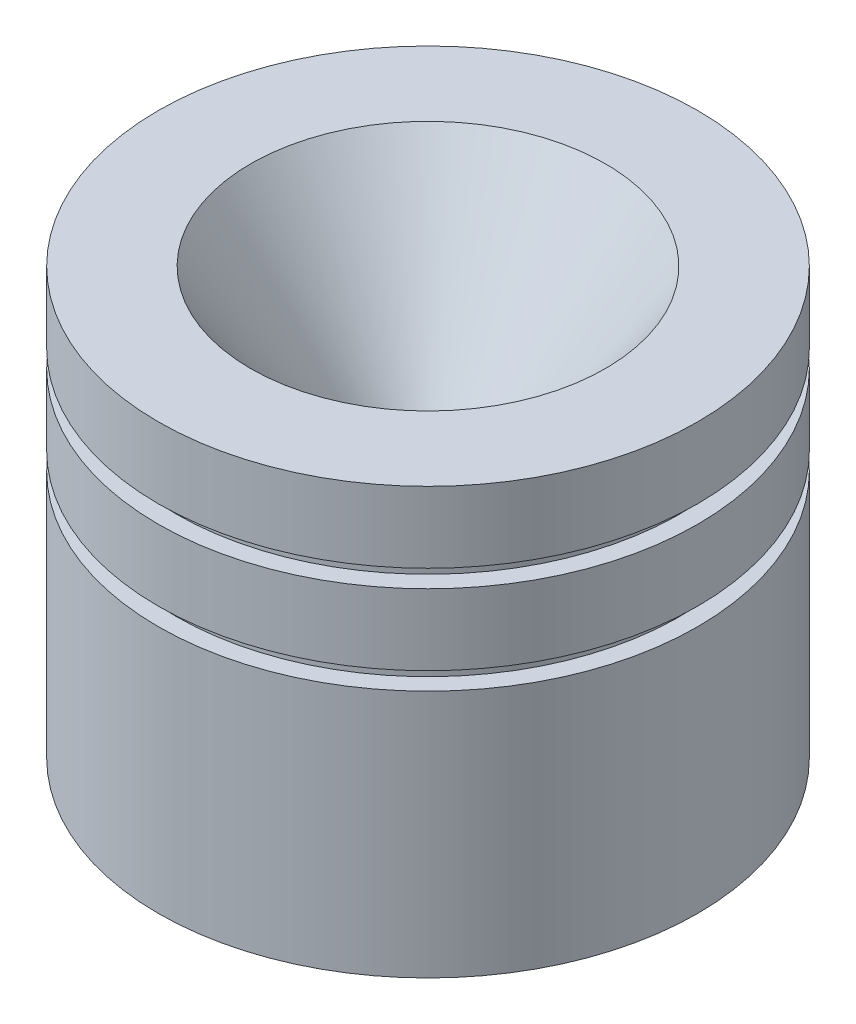
ISO-10303-21;
HEADER;
FILE_DESCRIPTION(('STEP AP214'),'2;1');
FILE_NAME('part.step','',(''),(''),'','','');
FILE_SCHEMA(('AUTOMOTIVE_DESIGN { 1 0 10303 214 1 1 1 1 }'));
ENDSEC;
DATA;
#1=APPLICATION_CONTEXT('core data for automotive mechanical design processes');
#2=APPLICATION_PROTOCOL_DEFINITION('international standard','automotive_design',2000,#1);
#3=PRODUCT_CONTEXT('',#1,'mechanical');
#4=PRODUCT('Part','Part','',(#3));
#5=PRODUCT_RELATED_PRODUCT_CATEGORY('part','',(#4));
#6=PRODUCT_DEFINITION_FORMATION('','',#4);
#7=PRODUCT_DEFINITION_CONTEXT('part definition',#1,'design');
#8=PRODUCT_DEFINITION('design','',#6,#7);
#9=PRODUCT_DEFINITION_SHAPE('','',#8);
#10=(LENGTH_UNIT() NAMED_UNIT(*) SI_UNIT(.MILLI.,.METRE.));
#11=(NAMED_UNIT(*) PLANE_ANGLE_UNIT() SI_UNIT($,.RADIAN.));
#12=(NAMED_UNIT(*) SI_UNIT($,.STERADIAN.) SOLID_ANGLE_UNIT());
#13=UNCERTAINTY_MEASURE_WITH_UNIT(LENGTH_MEASURE(1.E-05),#10,'distance_accuracy_value','');
#14=(GEOMETRIC_REPRESENTATION_CONTEXT(3) GLOBAL_UNCERTAINTY_ASSIGNED_CONTEXT((#13)) GLOBAL_UNIT_ASSIGNED_CONTEXT((#10,
#11,#12)) REPRESENTATION_CONTEXT('',''));
#15=CARTESIAN_POINT('',(0.,0.,0.));
#16=DIRECTION('',(0.,0.,1.));
#17=DIRECTION('',(1.,0.,0.));
#18=AXIS2_PLACEMENT_3D('',#15,#16,#17);
#19=CARTESIAN_POINT('',(0.,0.,0.));
#20=DIRECTION('',(0.,-1.,0.));
#21=DIRECTION('',(0.,0.,-1.));
#22=AXIS2_PLACEMENT_3D('',#19,#20,#21);
#23=CYLINDRICAL_SURFACE('',#22,48.26);
#24=CARTESIAN_POINT('',(0.,76.2,0.));
#25=DIRECTION('',(0.,-1.,0.));
#26=DIRECTION('',(0.,0.,-1.));
#27=AXIS2_PLACEMENT_3D('',#24,#25,#26);
#28=CIRCLE('',#27,48.26);
#29=CARTESIAN_POINT('',(0.,76.2,-48.26));
#30=VERTEX_POINT('',#29);
#31=EDGE_CURVE('E75',#30,#30,#28,.T.);
#32=ORIENTED_EDGE('',*,*,#31,.T.);
#33=EDGE_LOOP('',(#32));
#34=FACE_BOUND('',#33,.T.);
#35=CARTESIAN_POINT('',(0.,63.5,0.));
#36=DIRECTION('',(0.,-1.,0.));
#37=DIRECTION('',(0.,0.,-1.));
#38=AXIS2_PLACEMENT_3D('',#35,#36,#37);
#39=CIRCLE('',#38,48.26);
#40=CARTESIAN_POINT('',(0.,63.5,-48.26));
#41=VERTEX_POINT('',#40);
#42=EDGE_CURVE('E61',#41,#41,#39,.F.);
#43=ORIENTED_EDGE('',*,*,#42,.T.);
#44=EDGE_LOOP('',(#43));
#45=FACE_BOUND('',#44,.T.);
#46=ADVANCED_FACE('F38',(#34,#45),#23,.T.);
#47=CARTESIAN_POINT('',(0.,0.,0.));
#48=DIRECTION('',(0.,-1.,0.));
#49=DIRECTION('',(0.,0.,-1.));
#50=AXIS2_PLACEMENT_3D('',#47,#48,#49);
#51=CIRCLE('',#50,48.26);
#52=CARTESIAN_POINT('',(0.,0.,-48.26));
#53=VERTEX_POINT('',#52);
#54=EDGE_CURVE('E51',#53,#53,#51,.T.);
#55=ORIENTED_EDGE('',*,*,#54,.F.);
#56=EDGE_LOOP('',(#55));
#57=FACE_BOUND('',#56,.T.);
#58=CARTESIAN_POINT('',(0.,44.45,0.));
#59=DIRECTION('',(0.,1.,0.));
#60=DIRECTION('',(0.,0.,1.));
#61=AXIS2_PLACEMENT_3D('',#58,#59,#60);
#62=CIRCLE('',#61,48.26);
#63=CARTESIAN_POINT('',(0.,44.45,48.26));
#64=VERTEX_POINT('',#63);
#65=EDGE_CURVE('E58',#64,#64,#62,.F.);
#66=ORIENTED_EDGE('',*,*,#65,.T.);
#67=EDGE_LOOP('',(#66));
#68=FACE_BOUND('',#67,.T.);
#69=ADVANCED_FACE('F88',(#57,#68),#23,.T.);
#70=CARTESIAN_POINT('',(46.99,0.,0.));
#71=DIRECTION('',(0.,-1.,0.));
#72=DIRECTION('',(0.,0.,-1.));
#73=AXIS2_PLACEMENT_3D('',#70,#71,#72);
#74=PLANE('',#73);
#75=ORIENTED_EDGE('',*,*,#54,.T.);
#76=EDGE_LOOP('',(#75));
#77=FACE_BOUND('',#76,.T.);
#78=CARTESIAN_POINT('',(0.,0.,0.));
#79=DIRECTION('',(0.,-1.,0.));
#80=DIRECTION('',(0.,0.,-1.));
#81=AXIS2_PLACEMENT_3D('',#78,#79,#80);
#82=CIRCLE('',#81,46.99);
#83=CARTESIAN_POINT('',(0.,0.,-46.99));
#84=VERTEX_POINT('',#83);
#85=EDGE_CURVE('E66',#84,#84,#82,.T.);
#86=ORIENTED_EDGE('',*,*,#85,.F.);
#87=EDGE_LOOP('',(#86));
#88=FACE_BOUND('',#87,.T.);
#89=ADVANCED_FACE('F85',(#77,#88),#74,.T.);
#90=CARTESIAN_POINT('',(48.26,76.2,0.));
#91=DIRECTION('',(0.,1.,0.));
#92=DIRECTION('',(0.,0.,1.));
#93=AXIS2_PLACEMENT_3D('',#90,#91,#92);
#94=PLANE('',#93);
#95=CARTESIAN_POINT('',(0.,76.2,0.));
#96=DIRECTION('',(0.,-1.,0.));
#97=DIRECTION('',(0.,0.,-1.));
#98=AXIS2_PLACEMENT_3D('',#95,#96,#97);
#99=CIRCLE('',#98,31.75);
#100=CARTESIAN_POINT('',(0.,76.2,31.75));
#101=VERTEX_POINT('',#100);
#102=EDGE_CURVE('E70',#101,#101,#99,.T.);
#103=ORIENTED_EDGE('',*,*,#102,.T.);
#104=EDGE_LOOP('',(#103));
#105=FACE_BOUND('',#104,.T.);
#106=ORIENTED_EDGE('',*,*,#31,.F.);
#107=EDGE_LOOP('',(#106));
#108=FACE_BOUND('',#107,.T.);
#109=ADVANCED_FACE('F214',(#105,#108),#94,.T.);
#110=CARTESIAN_POINT('',(0.,76.2,0.));
#111=DIRECTION('',(0.,1.,0.));
#112=DIRECTION('',(0.,0.,1.));
#113=AXIS2_PLACEMENT_3D('',#110,#111,#112);
#114=CONICAL_SURFACE('',#113,31.75,0.620249485982827);
#115=CARTESIAN_POINT('',(0.,42.3909125921057,0.));
#116=DIRECTION('',(0.,-1.,0.));
#117=DIRECTION('',(0.,0.,-1.));
#118=AXIS2_PLACEMENT_3D('',#115,#116,#117);
#119=CIRCLE('',#118,7.60065185150379);
#120=CARTESIAN_POINT('',(0.,42.3909125921057,7.60065185150379));
#121=VERTEX_POINT('',#120);
#122=EDGE_CURVE('E46',#121,#121,#119,.T.);
#123=CARTESIAN_POINT('',(0.,42.3909125921057,7.60065185150379));
#124=CARTESIAN_POINT('',(0.,42.7430905859379,7.85220756138396));
#125=CARTESIAN_POINT('',(0.,43.0952685797702,8.10376327126413));
#126=CARTESIAN_POINT('',(0.,43.7996245674346,8.60687469102447));
#127=CARTESIAN_POINT('',(0.,44.1518025612669,8.85843040090463));
#128=CARTESIAN_POINT('',(0.,44.8561585489313,9.36154182066497));
#129=CARTESIAN_POINT('',(0.,45.2083365427636,9.61309753054514));
#130=CARTESIAN_POINT('',(0.,45.912692530428,10.1162089503055));
#131=CARTESIAN_POINT('',(0.,46.2648705242603,10.3677646601856));
#132=CARTESIAN_POINT('',(0.,46.9692265119247,10.870876079946));
#133=CARTESIAN_POINT('',(0.,47.3214045057569,11.1224317898262));
#134=CARTESIAN_POINT('',(0.,48.0257604934214,11.6255432095865));
#135=CARTESIAN_POINT('',(0.,48.3779384872537,11.8770989194667));
#136=CARTESIAN_POINT('',(0.,49.0822944749181,12.380210339227));
#137=CARTESIAN_POINT('',(0.,49.4344724687503,12.6317660491072));
#138=CARTESIAN_POINT('',(0.,50.1388284564148,13.1348774688675));
#139=CARTESIAN_POINT('',(0.,50.491006450247,13.3864331787477));
#140=CARTESIAN_POINT('',(0.,51.1953624379115,13.889544598508));
#141=CARTESIAN_POINT('',(0.,51.5475404317437,14.1411003083882));
#142=CARTESIAN_POINT('',(0.,52.2518964194082,14.6442117281485));
#143=CARTESIAN_POINT('',(0.,52.6040744132404,14.8957674380287));
#144=CARTESIAN_POINT('',(0.,53.3084304009049,15.398878857789));
#145=CARTESIAN_POINT('',(0.,53.6606083947371,15.6504345676692));
#146=CARTESIAN_POINT('',(0.,54.3649643824016,16.1535459874295));
#147=CARTESIAN_POINT('',(0.,54.7171423762338,16.4051016973097));
#148=CARTESIAN_POINT('',(0.,55.4214983638983,16.90821311707));
#149=CARTESIAN_POINT('',(0.,55.7736763577305,17.1597688269502));
#150=CARTESIAN_POINT('',(0.,56.478032345395,17.6628802467105));
#151=CARTESIAN_POINT('',(0.,56.8302103392272,17.9144359565907));
#152=CARTESIAN_POINT('',(0.,57.5345663268917,18.4175473763511));
#153=CARTESIAN_POINT('',(0.,57.8867443207239,18.6691030862312));
#154=CARTESIAN_POINT('',(0.,58.5911003083884,19.1722145059916));
#155=CARTESIAN_POINT('',(0.,58.9432783022206,19.4237702158717));
#156=CARTESIAN_POINT('',(0.,59.6476342898851,19.9268816356321));
#157=CARTESIAN_POINT('',(0.,59.9998122837173,20.1784373455122));
#158=CARTESIAN_POINT('',(0.,60.7041682713818,20.6815487652726));
#159=CARTESIAN_POINT('',(0.,61.056346265214,20.9331044751527));
#160=CARTESIAN_POINT('',(0.,61.7607022528785,21.4362158949131));
#161=CARTESIAN_POINT('',(0.,62.1128802467107,21.6877716047933));
#162=CARTESIAN_POINT('',(0.,62.8172362343752,22.1908830245536));
#163=CARTESIAN_POINT('',(0.,63.1694142282074,22.4424387344338));
#164=CARTESIAN_POINT('',(0.,63.8737702158719,22.9455501541941));
#165=CARTESIAN_POINT('',(0.,64.2259482097041,23.1971058640743));
#166=CARTESIAN_POINT('',(0.,64.9303041973686,23.7002172838346));
#167=CARTESIAN_POINT('',(0.,65.2824821912008,23.9517729937148));
#168=CARTESIAN_POINT('',(0.,65.9868381788653,24.4548844134751));
#169=CARTESIAN_POINT('',(0.,66.3390161726975,24.7064401233553));
#170=CARTESIAN_POINT('',(0.,67.043372160362,25.2095515431156));
#171=CARTESIAN_POINT('',(0.,67.3955501541942,25.4611072529958));
#172=CARTESIAN_POINT('',(0.,68.0999061418587,25.9642186727561));
#173=CARTESIAN_POINT('',(0.,68.4520841356909,26.2157743826363));
#174=CARTESIAN_POINT('',(0.,69.1564401233554,26.7188858023966));
#175=CARTESIAN_POINT('',(0.,69.5086181171876,26.9704415122768));
#176=CARTESIAN_POINT('',(0.,70.2129741048521,27.4735529320371));
#177=CARTESIAN_POINT('',(0.,70.5651520986843,27.7251086419173));
#178=CARTESIAN_POINT('',(0.,71.2695080863487,28.2282200616776));
#179=CARTESIAN_POINT('',(0.,71.621686080181,28.4797757715578));
#180=CARTESIAN_POINT('',(0.,72.3260420678454,28.9828871913181));
#181=CARTESIAN_POINT('',(0.,72.6782200616777,29.2344429011983));
#182=CARTESIAN_POINT('',(0.,73.3825760493421,29.7375543209587));
#183=CARTESIAN_POINT('',(0.,73.7347540431744,29.9891100308388));
#184=CARTESIAN_POINT('',(0.,74.4391100308388,30.4922214505992));
#185=CARTESIAN_POINT('',(0.,74.7912880246711,30.7437771604793));
#186=CARTESIAN_POINT('',(0.,75.4956440123355,31.2468885802397));
#187=CARTESIAN_POINT('',(0.,75.8478220061678,31.4984442901198));
#188=CARTESIAN_POINT('',(0.,76.2,31.75));
#189=B_SPLINE_CURVE_WITH_KNOTS('',3,(#123,#124,#125,#126,#127,#128,#129,#130,#131,#132,#133,
#134,#135,#136,#137,#138,#139,#140,#141,#142,#143,#144,#145,#146,#147,#148,#149,#150,#151,#152,
#153,#154,#155,#156,#157,#158,#159,#160,#161,#162,#163,#164,#165,#166,#167,#168,#169,#170,#171,
#172,#173,#174,#175,#176,#177,#178,#179,#180,#181,#182,#183,#184,#185,#186,#187,#188),
.UNSPECIFIED.,.F.,.F.,(4,2,2,2,2,2,2,2,2,2,2,2,2,2,2,2,2,2,2,2,2,2,2,2,2,2,2,2,2,2,2,2,4),(0.,
1.2983784235026,2.59675684700521,3.89513527050781,5.19351369401041,6.49189211751301,
7.79027054101562,9.08864896451822,10.3870273880208,11.6854058115234,12.983784235026,
14.2821626585286,15.5805410820312,16.8789195055338,18.1772979290364,19.475676352539,
20.7740547760416,22.0724331995442,23.3708116230468,24.6691900465494,25.9675684700521,
27.2659468935547,28.5643253170572,29.8627037405599,31.1610821640625,32.4594605875651,
33.7578390110677,35.0562174345703,36.3545958580729,37.6529742815755,38.9513527050781,
40.2497311285807,41.5481095520833),.UNSPECIFIED.);
#190=EDGE_CURVE('BSEAM205',#121,#101,#189,.T.);
#191=ORIENTED_EDGE('',*,*,#122,.T.);
#192=ORIENTED_EDGE('',*,*,#102,.F.);
#193=ORIENTED_EDGE('',*,*,#190,.T.);
#194=ORIENTED_EDGE('',*,*,#190,.F.);
#195=EDGE_LOOP('',(#191,#193,#192,#194));
#196=FACE_BOUND('',#195,.T.);
#197=ADVANCED_FACE('F205',(#196),#114,.F.);
#198=CARTESIAN_POINT('',(0.,40.6400000000004,0.));
#199=DIRECTION('',(0.,-1.,0.));
#200=DIRECTION('',(0.,0.,-1.));
#201=AXIS2_PLACEMENT_3D('',#198,#199,#200);
#202=CONICAL_SURFACE('',#201,6.35,0.785398163397443);
#203=CARTESIAN_POINT('',(0.,39.1185163558454,0.));
#204=DIRECTION('',(0.,1.,0.));
#205=DIRECTION('',(0.,0.,1.));
#206=AXIS2_PLACEMENT_3D('',#203,#204,#205);
#207=CIRCLE('',#206,7.87148364415504);
#208=CARTESIAN_POINT('',(0.,39.1185163558454,-7.87148364415505));
#209=VERTEX_POINT('',#208);
#210=EDGE_CURVE('E10',#209,#209,#207,.T.);
#211=CARTESIAN_POINT('',(0.,39.1185163558454,-7.87148364415505));
#212=CARTESIAN_POINT('',(0.,38.711031810472,-8.27896818952843));
#213=CARTESIAN_POINT('',(0.,38.3035472650986,-8.68645273490182));
#214=CARTESIAN_POINT('',(0.,37.4885781743518,-9.50142182564859));
#215=CARTESIAN_POINT('',(0.,37.0810936289784,-9.90890637102197));
#216=CARTESIAN_POINT('',(0.,36.2661245382316,-10.7238754617687));
#217=CARTESIAN_POINT('',(0.,35.8586399928582,-11.1313600071421));
#218=CARTESIAN_POINT('',(0.,35.0436709021115,-11.9463290978889));
#219=CARTESIAN_POINT('',(0.,34.6361863567381,-12.3538136432623));
#220=CARTESIAN_POINT('',(0.,33.8212172659913,-13.168782734009));
#221=CARTESIAN_POINT('',(0.,33.4137327206179,-13.5762672793824));
#222=CARTESIAN_POINT('',(0.,32.5987636298711,-14.3912363701292));
#223=CARTESIAN_POINT('',(0.,32.1912790844977,-14.7987209155026));
#224=CARTESIAN_POINT('',(0.,31.376309993751,-15.6136900062494));
#225=CARTESIAN_POINT('',(0.,30.9688254483776,-16.0211745516227));
#226=CARTESIAN_POINT('',(0.,30.1538563576308,-16.8361436423695));
#227=CARTESIAN_POINT('',(0.,29.7463718122574,-17.2436281877429));
#228=CARTESIAN_POINT('',(0.,28.9314027215106,-18.0585972784897));
#229=CARTESIAN_POINT('',(0.,28.5239181761372,-18.4660818238631));
#230=CARTESIAN_POINT('',(0.,27.7089490853905,-19.2810509146098));
#231=CARTESIAN_POINT('',(0.,27.3014645400171,-19.6885354599832));
#232=CARTESIAN_POINT('',(0.,26.4864954492703,-20.50350455073));
#233=CARTESIAN_POINT('',(0.,26.0790109038969,-20.9109890961034));
#234=CARTESIAN_POINT('',(0.,25.2640418131501,-21.7259581868501));
#235=CARTESIAN_POINT('',(0.,24.8565572677767,-22.1334427322235));
#236=CARTESIAN_POINT('',(0.,24.04158817703,-22.9484118229703));
#237=CARTESIAN_POINT('',(0.,23.6341036316566,-23.3558963683437));
#238=CARTESIAN_POINT('',(0.,22.8191345409098,-24.1708654590904));
#239=CARTESIAN_POINT('',(0.,22.4116499955364,-24.5783500044638));
#240=CARTESIAN_POINT('',(0.,21.5966809047896,-25.3933190952106));
#241=CARTESIAN_POINT('',(0.,21.1891963594162,-25.800803640584));
#242=CARTESIAN_POINT('',(0.,20.3742272686695,-26.6157727313308));
#243=CARTESIAN_POINT('',(0.,19.9667427232961,-27.0232572767041));
#244=CARTESIAN_POINT('',(0.,19.1517736325493,-27.8382263674509));
#245=CARTESIAN_POINT('',(0.,18.7442890871759,-28.2457109128243));
#246=CARTESIAN_POINT('',(0.,17.9293199964291,-29.0606800035711));
#247=CARTESIAN_POINT('',(0.,17.5218354510557,-29.4681645489444));
#248=CARTESIAN_POINT('',(0.,16.706866360309,-30.2831336396912));
#249=CARTESIAN_POINT('',(0.,16.2993818149356,-30.6906181850646));
#250=CARTESIAN_POINT('',(0.,15.4844127241888,-31.5055872758114));
#251=CARTESIAN_POINT('',(0.,15.0769281788154,-31.9130718211848));
#252=CARTESIAN_POINT('',(0.,14.2619590880686,-32.7280409119315));
#253=CARTESIAN_POINT('',(0.,13.8544745426952,-33.1355254573049));
#254=CARTESIAN_POINT('',(0.,13.0395054519485,-33.9504945480517));
#255=CARTESIAN_POINT('',(0.,12.6320209065751,-34.3579790934251));
#256=CARTESIAN_POINT('',(0.,11.8170518158283,-35.1729481841718));
#257=CARTESIAN_POINT('',(0.,11.4095672704549,-35.5804327295452));
#258=CARTESIAN_POINT('',(0.,10.5945981797081,-36.395401820292));
#259=CARTESIAN_POINT('',(0.,10.1871136343347,-36.8028863656654));
#260=CARTESIAN_POINT('',(0.,9.37214454358796,-37.6178554564121));
#261=CARTESIAN_POINT('',(0.,8.96465999821457,-38.0253400017855));
#262=CARTESIAN_POINT('',(0.,8.14969090746779,-38.8403090925323));
#263=CARTESIAN_POINT('',(0.,7.74220636209439,-39.2477936379057));
#264=CARTESIAN_POINT('',(0.,6.92723727134762,-40.0627627286525));
#265=CARTESIAN_POINT('',(0.,6.51975272597424,-40.4702472740258));
#266=CARTESIAN_POINT('',(0.,5.70478363522746,-41.2852163647726));
#267=CARTESIAN_POINT('',(0.,5.29729908985407,-41.692700910146));
#268=CARTESIAN_POINT('',(0.,4.48232999910729,-42.5076700008928));
#269=CARTESIAN_POINT('',(0.,4.0748454537339,-42.9151545462661));
#270=CARTESIAN_POINT('',(0.,3.25987636298712,-43.7301236370129));
#271=CARTESIAN_POINT('',(0.,2.85239181761373,-44.1376081823863));
#272=CARTESIAN_POINT('',(0.,2.03742272686695,-44.9525772731331));
#273=CARTESIAN_POINT('',(0.,1.62993818149357,-45.3600618185065));
#274=CARTESIAN_POINT('',(0.,0.814969090746786,-46.1750309092532));
#275=CARTESIAN_POINT('',(0.,0.407484545373397,-46.5825154546266));
#276=CARTESIAN_POINT('',(0.,0.,-46.99));
#277=B_SPLINE_CURVE_WITH_KNOTS('',3,(#211,#212,#213,#214,#215,#216,#217,#218,#219,#220,#221,
#222,#223,#224,#225,#226,#227,#228,#229,#230,#231,#232,#233,#234,#235,#236,#237,#238,#239,#240,
#241,#242,#243,#244,#245,#246,#247,#248,#249,#250,#251,#252,#253,#254,#255,#256,#257,#258,#259,
#260,#261,#262,#263,#264,#265,#266,#267,#268,#269,#270,#271,#272,#273,#274,#275,#276),
.UNSPECIFIED.,.F.,.F.,(4,2,2,2,2,2,2,2,2,2,2,2,2,2,2,2,2,2,2,2,2,2,2,2,2,2,2,2,2,2,2,2,4),(0.,
1.72881051157344,3.45762102314687,5.18643153472031,6.91524204629375,8.64405255786718,
10.3728630694406,12.1016735810141,13.8304840925875,15.5592946041609,17.2881051157344,
19.0169156273078,20.7457261388812,22.4745366504547,24.2033471620281,25.9321576736015,
27.660968185175,29.3897786967484,31.1185892083218,32.8473997198953,34.5762102314687,
36.3050207430422,38.0338312546156,39.762641766189,41.4914522777625,43.2202627893359,
44.9490733009094,46.6778838124828,48.4066943240562,50.1355048356297,51.8643153472031,
53.5931258587765,55.32193637035),.UNSPECIFIED.);
#278=EDGE_CURVE('BSEAM196',#209,#84,#277,.T.);
#279=ORIENTED_EDGE('',*,*,#210,.T.);
#280=ORIENTED_EDGE('',*,*,#85,.T.);
#281=ORIENTED_EDGE('',*,*,#278,.T.);
#282=ORIENTED_EDGE('',*,*,#278,.F.);
#283=EDGE_LOOP('',(#279,#281,#280,#282));
#284=FACE_BOUND('',#283,.T.);
#285=ADVANCED_FACE('F196',(#284),#202,.F.);
#286=CARTESIAN_POINT('',(0.,40.9145675800592,0.));
#287=DIRECTION('',(0.,1.,0.));
#288=DIRECTION('',(0.,0.,1.));
#289=AXIS2_PLACEMENT_3D('',#286,#287,#288);
#290=TOROIDAL_SURFACE('',#289,9.66753486836888,2.54);
#291=ORIENTED_EDGE('',*,*,#210,.F.);
#292=EDGE_LOOP('',(#291));
#293=FACE_BOUND('',#292,.T.);
#294=ORIENTED_EDGE('',*,*,#122,.F.);
#295=EDGE_LOOP('',(#294));
#296=FACE_BOUND('',#295,.T.);
#297=ADVANCED_FACE('F40',(#293,#296),#290,.T.);
#298=CARTESIAN_POINT('',(57.785,44.45,0.));
#299=DIRECTION('',(0.,1.,0.));
#300=DIRECTION('',(0.,0.,1.));
#301=AXIS2_PLACEMENT_3D('',#298,#299,#300);
#302=PLANE('',#301);
#303=ORIENTED_EDGE('',*,*,#65,.F.);
#304=EDGE_LOOP('',(#303));
#305=FACE_BOUND('',#304,.T.);
#306=CARTESIAN_POINT('',(0.,44.45,0.));
#307=DIRECTION('',(0.,1.,0.));
#308=DIRECTION('',(0.,0.,1.));
#309=AXIS2_PLACEMENT_3D('',#306,#307,#308);
#310=CIRCLE('',#309,45.085);
#311=CARTESIAN_POINT('',(0.,44.45,45.085));
#312=VERTEX_POINT('',#311);
#313=EDGE_CURVE('E78',#312,#312,#310,.T.);
#314=ORIENTED_EDGE('',*,*,#313,.F.);
#315=EDGE_LOOP('',(#314));
#316=FACE_BOUND('',#315,.T.);
#317=ADVANCED_FACE('F95',(#305,#316),#302,.T.);
#318=CARTESIAN_POINT('',(0.,76.2,0.));
#319=DIRECTION('',(0.,1.,0.));
#320=DIRECTION('',(0.,0.,1.));
#321=AXIS2_PLACEMENT_3D('',#318,#319,#320);
#322=CYLINDRICAL_SURFACE('',#321,45.085);
#323=ORIENTED_EDGE('',*,*,#313,.T.);
#324=EDGE_LOOP('',(#323));
#325=FACE_BOUND('',#324,.T.);
#326=CARTESIAN_POINT('',(0.,47.625,0.));
#327=DIRECTION('',(0.,1.,0.));
#328=DIRECTION('',(0.,0.,1.));
#329=AXIS2_PLACEMENT_3D('',#326,#327,#328);
#330=CIRCLE('',#329,45.085);
#331=CARTESIAN_POINT('',(0.,47.625,45.085));
#332=VERTEX_POINT('',#331);
#333=EDGE_CURVE('E104',#332,#332,#330,.T.);
#334=ORIENTED_EDGE('',*,*,#333,.F.);
#335=EDGE_LOOP('',(#334));
#336=FACE_BOUND('',#335,.T.);
#337=ADVANCED_FACE('F98',(#325,#336),#322,.T.);
#338=CARTESIAN_POINT('',(57.785,47.625,0.));
#339=DIRECTION('',(0.,-1.,0.));
#340=DIRECTION('',(0.,0.,-1.));
#341=AXIS2_PLACEMENT_3D('',#338,#339,#340);
#342=PLANE('',#341);
#343=CARTESIAN_POINT('',(0.,47.625,0.));
#344=DIRECTION('',(0.,-1.,0.));
#345=DIRECTION('',(0.,0.,-1.));
#346=AXIS2_PLACEMENT_3D('',#343,#344,#345);
#347=CIRCLE('',#346,48.26);
#348=CARTESIAN_POINT('',(0.,47.625,-48.26));
#349=VERTEX_POINT('',#348);
#350=EDGE_CURVE('E55',#349,#349,#347,.F.);
#351=ORIENTED_EDGE('',*,*,#350,.F.);
#352=EDGE_LOOP('',(#351));
#353=FACE_BOUND('',#352,.T.);
#354=ORIENTED_EDGE('',*,*,#333,.T.);
#355=EDGE_LOOP('',(#354));
#356=FACE_BOUND('',#355,.T.);
#357=ADVANCED_FACE('F119',(#353,#356),#342,.T.);
#358=CARTESIAN_POINT('',(65.5321120793642,60.325,0.));
#359=DIRECTION('',(0.,1.,0.));
#360=DIRECTION('',(0.,0.,1.));
#361=AXIS2_PLACEMENT_3D('',#358,#359,#360);
#362=PLANE('',#361);
#363=CARTESIAN_POINT('',(0.,60.325,0.));
#364=DIRECTION('',(0.,1.,0.));
#365=DIRECTION('',(0.,0.,1.));
#366=AXIS2_PLACEMENT_3D('',#363,#364,#365);
#367=CIRCLE('',#366,48.26);
#368=CARTESIAN_POINT('',(0.,60.325,48.26));
#369=VERTEX_POINT('',#368);
#370=EDGE_CURVE('E42',#369,#369,#367,.F.);
#371=ORIENTED_EDGE('',*,*,#370,.F.);
#372=EDGE_LOOP('',(#371));
#373=FACE_BOUND('',#372,.T.);
#374=CARTESIAN_POINT('',(0.,60.325,0.));
#375=DIRECTION('',(0.,1.,0.));
#376=DIRECTION('',(0.,0.,1.));
#377=AXIS2_PLACEMENT_3D('',#374,#375,#376);
#378=CIRCLE('',#377,45.085);
#379=CARTESIAN_POINT('',(0.,60.325,45.085));
#380=VERTEX_POINT('',#379);
#381=EDGE_CURVE('E59',#380,#380,#378,.T.);
#382=ORIENTED_EDGE('',*,*,#381,.F.);
#383=EDGE_LOOP('',(#382));
#384=FACE_BOUND('',#383,.T.);
#385=ADVANCED_FACE('F117',(#373,#384),#362,.T.);
#386=CARTESIAN_POINT('',(0.,76.2,0.));
#387=DIRECTION('',(0.,1.,0.));
#388=DIRECTION('',(0.,0.,1.));
#389=AXIS2_PLACEMENT_3D('',#386,#387,#388);
#390=CYLINDRICAL_SURFACE('',#389,45.085);
#391=ORIENTED_EDGE('',*,*,#381,.T.);
#392=EDGE_LOOP('',(#391));
#393=FACE_BOUND('',#392,.T.);
#394=CARTESIAN_POINT('',(0.,63.5,0.));
#395=DIRECTION('',(0.,1.,0.));
#396=DIRECTION('',(0.,0.,1.));
#397=AXIS2_PLACEMENT_3D('',#394,#395,#396);
#398=CIRCLE('',#397,45.085);
#399=CARTESIAN_POINT('',(0.,63.5,45.085));
#400=VERTEX_POINT('',#399);
#401=EDGE_CURVE('E103',#400,#400,#398,.T.);
#402=ORIENTED_EDGE('',*,*,#401,.F.);
#403=EDGE_LOOP('',(#402));
#404=FACE_BOUND('',#403,.T.);
#405=ADVANCED_FACE('F114',(#393,#404),#390,.T.);
#406=CARTESIAN_POINT('',(65.5321120793642,63.5,0.));
#407=DIRECTION('',(0.,-1.,0.));
#408=DIRECTION('',(0.,0.,-1.));
#409=AXIS2_PLACEMENT_3D('',#406,#407,#408);
#410=PLANE('',#409);
#411=ORIENTED_EDGE('',*,*,#42,.F.);
#412=EDGE_LOOP('',(#411));
#413=FACE_BOUND('',#412,.T.);
#414=ORIENTED_EDGE('',*,*,#401,.T.);
#415=EDGE_LOOP('',(#414));
#416=FACE_BOUND('',#415,.T.);
#417=ADVANCED_FACE('F126',(#413,#416),#410,.T.);
#418=ORIENTED_EDGE('',*,*,#350,.T.);
#419=EDGE_LOOP('',(#418));
#420=FACE_BOUND('',#419,.T.);
#421=ORIENTED_EDGE('',*,*,#370,.T.);
#422=EDGE_LOOP('',(#421));
#423=FACE_BOUND('',#422,.T.);
#424=ADVANCED_FACE('F92',(#420,#423),#23,.T.);
#425=CLOSED_SHELL('',(#46,#69,#89,#109,#197,#285,#297,#317,#337,#357,#385,#405,#417,#424));
#426=MANIFOLD_SOLID_BREP('B2',#425);
#427=ADVANCED_BREP_SHAPE_REPRESENTATION('',(#18,#426),#14);
#428=SHAPE_DEFINITION_REPRESENTATION(#9,#427);
ENDSEC;
END-ISO-10303-21;
